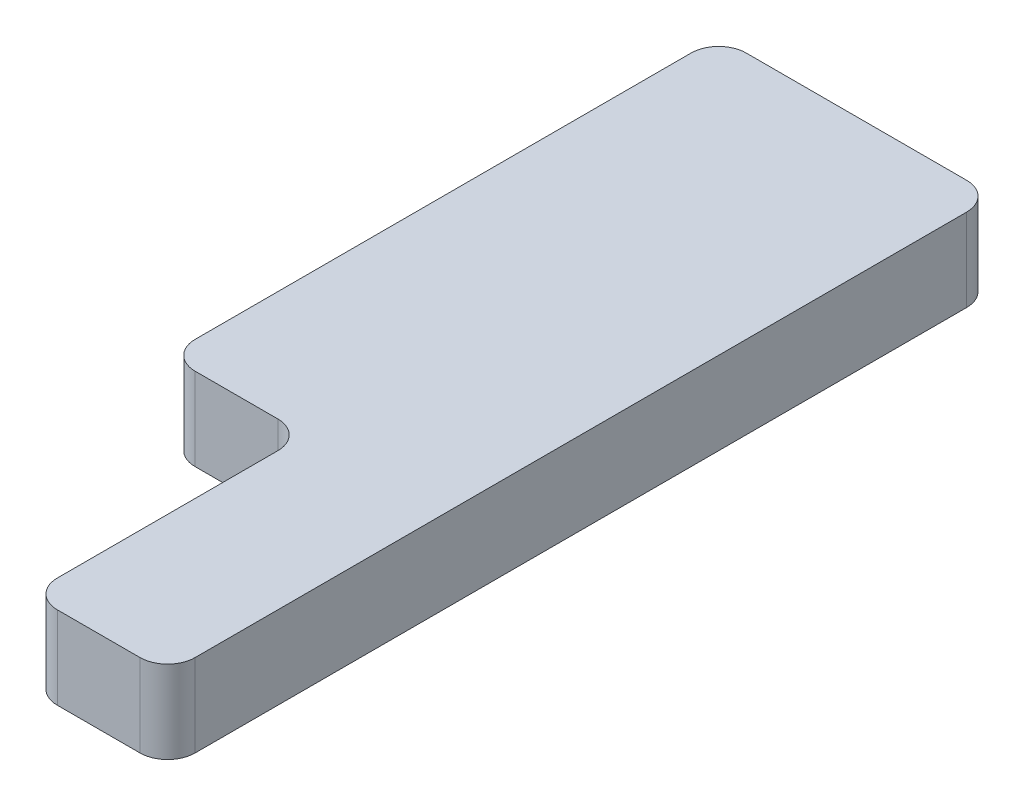
ISO-10303-21;
HEADER;
FILE_DESCRIPTION(('STEP AP214'),'2;1');
FILE_NAME('part.step','',(''),(''),'','','');
FILE_SCHEMA(('AUTOMOTIVE_DESIGN { 1 0 10303 214 1 1 1 1 }'));
ENDSEC;
DATA;
#1=APPLICATION_CONTEXT('core data for automotive mechanical design processes');
#2=APPLICATION_PROTOCOL_DEFINITION('international standard','automotive_design',2000,#1);
#3=PRODUCT_CONTEXT('',#1,'mechanical');
#4=PRODUCT('Part','Part','',(#3));
#5=PRODUCT_RELATED_PRODUCT_CATEGORY('part','',(#4));
#6=PRODUCT_DEFINITION_FORMATION('','',#4);
#7=PRODUCT_DEFINITION_CONTEXT('part definition',#1,'design');
#8=PRODUCT_DEFINITION('design','',#6,#7);
#9=PRODUCT_DEFINITION_SHAPE('','',#8);
#10=(LENGTH_UNIT() NAMED_UNIT(*) SI_UNIT(.MILLI.,.METRE.));
#11=(NAMED_UNIT(*) PLANE_ANGLE_UNIT() SI_UNIT($,.RADIAN.));
#12=(NAMED_UNIT(*) SI_UNIT($,.STERADIAN.) SOLID_ANGLE_UNIT());
#13=UNCERTAINTY_MEASURE_WITH_UNIT(LENGTH_MEASURE(1.E-05),#10,'distance_accuracy_value','');
#14=(GEOMETRIC_REPRESENTATION_CONTEXT(3) GLOBAL_UNCERTAINTY_ASSIGNED_CONTEXT((#13)) GLOBAL_UNIT_ASSIGNED_CONTEXT((#10,
#11,#12)) REPRESENTATION_CONTEXT('',''));
#15=CARTESIAN_POINT('',(0.,0.,0.));
#16=DIRECTION('',(0.,0.,1.));
#17=DIRECTION('',(1.,0.,0.));
#18=AXIS2_PLACEMENT_3D('',#15,#16,#17);
#19=CARTESIAN_POINT('',(4.,3.,-14.));
#20=DIRECTION('',(0.,-1.,0.));
#21=DIRECTION('',(0.,0.,-1.));
#22=AXIS2_PLACEMENT_3D('',#19,#20,#21);
#23=CYLINDRICAL_SURFACE('',#22,1.);
#24=DIRECTION('',(0.,-1.,0.));
#25=VECTOR('',#24,1.);
#26=CARTESIAN_POINT('',(4.,3.,-15.));
#27=LINE('',#26,#25);
#28=CARTESIAN_POINT('',(4.,3.,-15.));
#29=VERTEX_POINT('',#28);
#30=CARTESIAN_POINT('',(4.,0.,-15.));
#31=VERTEX_POINT('',#30);
#32=EDGE_CURVE('E191',#29,#31,#27,.T.);
#33=ORIENTED_EDGE('',*,*,#32,.F.);
#34=CARTESIAN_POINT('',(4.,3.,-14.));
#35=DIRECTION('',(0.,-1.,0.));
#36=DIRECTION('',(0.,0.,-1.));
#37=AXIS2_PLACEMENT_3D('',#34,#35,#36);
#38=CIRCLE('',#37,1.);
#39=CARTESIAN_POINT('',(5.,3.,-14.));
#40=VERTEX_POINT('',#39);
#41=EDGE_CURVE('E40',#40,#29,#38,.F.);
#42=ORIENTED_EDGE('',*,*,#41,.F.);
#43=DIRECTION('',(0.,-1.,0.));
#44=VECTOR('',#43,1.);
#45=CARTESIAN_POINT('',(5.,3.,-14.));
#46=LINE('',#45,#44);
#47=CARTESIAN_POINT('',(5.,0.,-14.));
#48=VERTEX_POINT('',#47);
#49=EDGE_CURVE('E194',#48,#40,#46,.F.);
#50=ORIENTED_EDGE('',*,*,#49,.F.);
#51=CARTESIAN_POINT('',(4.,0.,-14.));
#52=DIRECTION('',(0.,-1.,0.));
#53=DIRECTION('',(0.,0.,-1.));
#54=AXIS2_PLACEMENT_3D('',#51,#52,#53);
#55=CIRCLE('',#54,1.);
#56=EDGE_CURVE('E11',#31,#48,#55,.T.);
#57=ORIENTED_EDGE('',*,*,#56,.F.);
#58=EDGE_LOOP('',(#33,#42,#50,#57));
#59=FACE_BOUND('',#58,.T.);
#60=ADVANCED_FACE('F33',(#59),#23,.T.);
#61=CARTESIAN_POINT('',(-4.,3.,-14.));
#62=DIRECTION('',(0.,1.,0.));
#63=DIRECTION('',(0.,0.,1.));
#64=AXIS2_PLACEMENT_3D('',#61,#62,#63);
#65=CYLINDRICAL_SURFACE('',#64,1.);
#66=DIRECTION('',(0.,1.,0.));
#67=VECTOR('',#66,1.);
#68=CARTESIAN_POINT('',(-4.,3.,-15.));
#69=LINE('',#68,#67);
#70=CARTESIAN_POINT('',(-4.,0.,-15.));
#71=VERTEX_POINT('',#70);
#72=CARTESIAN_POINT('',(-4.,3.,-15.));
#73=VERTEX_POINT('',#72);
#74=EDGE_CURVE('E180',#71,#73,#69,.T.);
#75=ORIENTED_EDGE('',*,*,#74,.F.);
#76=CARTESIAN_POINT('',(-4.,0.,-14.));
#77=DIRECTION('',(0.,-1.,0.));
#78=DIRECTION('',(0.,0.,-1.));
#79=AXIS2_PLACEMENT_3D('',#76,#77,#78);
#80=CIRCLE('',#79,1.);
#81=CARTESIAN_POINT('',(-5.,0.,-14.));
#82=VERTEX_POINT('',#81);
#83=EDGE_CURVE('E186',#82,#71,#80,.T.);
#84=ORIENTED_EDGE('',*,*,#83,.F.);
#85=DIRECTION('',(0.,1.,0.));
#86=VECTOR('',#85,1.);
#87=CARTESIAN_POINT('',(-5.,3.,-14.));
#88=LINE('',#87,#86);
#89=CARTESIAN_POINT('',(-5.,3.,-14.));
#90=VERTEX_POINT('',#89);
#91=EDGE_CURVE('E183',#90,#82,#88,.F.);
#92=ORIENTED_EDGE('',*,*,#91,.F.);
#93=CARTESIAN_POINT('',(-4.,3.,-14.));
#94=DIRECTION('',(0.,-1.,0.));
#95=DIRECTION('',(0.,0.,-1.));
#96=AXIS2_PLACEMENT_3D('',#93,#94,#95);
#97=CIRCLE('',#96,1.);
#98=EDGE_CURVE('E189',#73,#90,#97,.F.);
#99=ORIENTED_EDGE('',*,*,#98,.F.);
#100=EDGE_LOOP('',(#75,#84,#92,#99));
#101=FACE_BOUND('',#100,.T.);
#102=ADVANCED_FACE('F230',(#101),#65,.T.);
#103=CARTESIAN_POINT('',(-4.,3.,4.));
#104=DIRECTION('',(0.,1.,0.));
#105=DIRECTION('',(0.,0.,1.));
#106=AXIS2_PLACEMENT_3D('',#103,#104,#105);
#107=CYLINDRICAL_SURFACE('',#106,1.);
#108=DIRECTION('',(0.,1.,0.));
#109=VECTOR('',#108,1.);
#110=CARTESIAN_POINT('',(-5.,3.,4.));
#111=LINE('',#110,#109);
#112=CARTESIAN_POINT('',(-5.,0.,4.));
#113=VERTEX_POINT('',#112);
#114=CARTESIAN_POINT('',(-5.,3.,4.));
#115=VERTEX_POINT('',#114);
#116=EDGE_CURVE('E169',#113,#115,#111,.T.);
#117=ORIENTED_EDGE('',*,*,#116,.F.);
#118=CARTESIAN_POINT('',(-4.,0.,4.));
#119=DIRECTION('',(0.,-1.,0.));
#120=DIRECTION('',(0.,0.,-1.));
#121=AXIS2_PLACEMENT_3D('',#118,#119,#120);
#122=CIRCLE('',#121,1.);
#123=CARTESIAN_POINT('',(-4.,0.,5.));
#124=VERTEX_POINT('',#123);
#125=EDGE_CURVE('E175',#124,#113,#122,.T.);
#126=ORIENTED_EDGE('',*,*,#125,.F.);
#127=DIRECTION('',(0.,1.,0.));
#128=VECTOR('',#127,1.);
#129=CARTESIAN_POINT('',(-4.,0.,5.));
#130=LINE('',#129,#128);
#131=CARTESIAN_POINT('',(-4.,3.,5.));
#132=VERTEX_POINT('',#131);
#133=EDGE_CURVE('E172',#132,#124,#130,.F.);
#134=ORIENTED_EDGE('',*,*,#133,.F.);
#135=CARTESIAN_POINT('',(-4.,3.,4.));
#136=DIRECTION('',(0.,-1.,0.));
#137=DIRECTION('',(0.,0.,-1.));
#138=AXIS2_PLACEMENT_3D('',#135,#136,#137);
#139=CIRCLE('',#138,1.);
#140=EDGE_CURVE('E178',#115,#132,#139,.F.);
#141=ORIENTED_EDGE('',*,*,#140,.F.);
#142=EDGE_LOOP('',(#117,#126,#134,#141));
#143=FACE_BOUND('',#142,.T.);
#144=ADVANCED_FACE('F225',(#143),#107,.T.);
#145=CARTESIAN_POINT('',(-1.,0.,6.));
#146=DIRECTION('',(0.,-1.,0.));
#147=DIRECTION('',(0.,0.,-1.));
#148=AXIS2_PLACEMENT_3D('',#145,#146,#147);
#149=CYLINDRICAL_SURFACE('',#148,1.);
#150=DIRECTION('',(0.,1.,0.));
#151=VECTOR('',#150,1.);
#152=CARTESIAN_POINT('',(-1.,0.,5.));
#153=LINE('',#152,#151);
#154=CARTESIAN_POINT('',(-1.,0.,5.));
#155=VERTEX_POINT('',#154);
#156=CARTESIAN_POINT('',(-1.,3.,5.));
#157=VERTEX_POINT('',#156);
#158=EDGE_CURVE('E159',#155,#157,#153,.T.);
#159=ORIENTED_EDGE('',*,*,#158,.F.);
#160=CARTESIAN_POINT('',(-1.,0.,6.));
#161=DIRECTION('',(0.,-1.,0.));
#162=DIRECTION('',(0.,0.,-1.));
#163=AXIS2_PLACEMENT_3D('',#160,#161,#162);
#164=CIRCLE('',#163,1.);
#165=CARTESIAN_POINT('',(0.,0.,6.));
#166=VERTEX_POINT('',#165);
#167=EDGE_CURVE('E165',#155,#166,#164,.T.);
#168=ORIENTED_EDGE('',*,*,#167,.T.);
#169=DIRECTION('',(0.,1.,0.));
#170=VECTOR('',#169,1.);
#171=CARTESIAN_POINT('',(0.,0.,6.));
#172=LINE('',#171,#170);
#173=CARTESIAN_POINT('',(0.,3.,6.));
#174=VERTEX_POINT('',#173);
#175=EDGE_CURVE('E162',#174,#166,#172,.F.);
#176=ORIENTED_EDGE('',*,*,#175,.F.);
#177=CARTESIAN_POINT('',(-1.,3.,6.));
#178=DIRECTION('',(0.,-1.,0.));
#179=DIRECTION('',(0.,0.,-1.));
#180=AXIS2_PLACEMENT_3D('',#177,#178,#179);
#181=CIRCLE('',#180,1.);
#182=EDGE_CURVE('E167',#174,#157,#181,.F.);
#183=ORIENTED_EDGE('',*,*,#182,.T.);
#184=EDGE_LOOP('',(#159,#168,#176,#183));
#185=FACE_BOUND('',#184,.T.);
#186=ADVANCED_FACE('F236',(#185),#149,.F.);
#187=CARTESIAN_POINT('',(0.999999999999999,0.,14.));
#188=DIRECTION('',(0.,1.,0.));
#189=DIRECTION('',(0.,0.,1.));
#190=AXIS2_PLACEMENT_3D('',#187,#188,#189);
#191=CYLINDRICAL_SURFACE('',#190,1.);
#192=DIRECTION('',(0.,1.,0.));
#193=VECTOR('',#192,1.);
#194=CARTESIAN_POINT('',(0.,0.,14.));
#195=LINE('',#194,#193);
#196=CARTESIAN_POINT('',(0.,0.,14.));
#197=VERTEX_POINT('',#196);
#198=CARTESIAN_POINT('',(0.,3.,14.));
#199=VERTEX_POINT('',#198);
#200=EDGE_CURVE('E139',#197,#199,#195,.T.);
#201=ORIENTED_EDGE('',*,*,#200,.F.);
#202=CARTESIAN_POINT('',(0.999999999999999,0.,14.));
#203=DIRECTION('',(0.,-1.,0.));
#204=DIRECTION('',(0.,0.,-1.));
#205=AXIS2_PLACEMENT_3D('',#202,#203,#204);
#206=CIRCLE('',#205,1.);
#207=CARTESIAN_POINT('',(0.999999999999999,0.,15.));
#208=VERTEX_POINT('',#207);
#209=EDGE_CURVE('E156',#208,#197,#206,.T.);
#210=ORIENTED_EDGE('',*,*,#209,.F.);
#211=DIRECTION('',(0.,1.,0.));
#212=VECTOR('',#211,1.);
#213=CARTESIAN_POINT('',(0.999999999999999,3.,15.));
#214=LINE('',#213,#212);
#215=CARTESIAN_POINT('',(0.999999999999999,3.,15.));
#216=VERTEX_POINT('',#215);
#217=EDGE_CURVE('E154',#216,#208,#214,.F.);
#218=ORIENTED_EDGE('',*,*,#217,.F.);
#219=CARTESIAN_POINT('',(0.999999999999999,3.,14.));
#220=DIRECTION('',(0.,-1.,0.));
#221=DIRECTION('',(0.,0.,-1.));
#222=AXIS2_PLACEMENT_3D('',#219,#220,#221);
#223=CIRCLE('',#222,1.);
#224=EDGE_CURVE('E125',#199,#216,#223,.F.);
#225=ORIENTED_EDGE('',*,*,#224,.F.);
#226=EDGE_LOOP('',(#201,#210,#218,#225));
#227=FACE_BOUND('',#226,.T.);
#228=ADVANCED_FACE('F241',(#227),#191,.T.);
#229=CARTESIAN_POINT('',(4.,3.,14.));
#230=DIRECTION('',(0.,1.,0.));
#231=DIRECTION('',(0.,0.,1.));
#232=AXIS2_PLACEMENT_3D('',#229,#230,#231);
#233=CYLINDRICAL_SURFACE('',#232,1.);
#234=DIRECTION('',(0.,1.,0.));
#235=VECTOR('',#234,1.);
#236=CARTESIAN_POINT('',(4.,3.,15.));
#237=LINE('',#236,#235);
#238=CARTESIAN_POINT('',(4.,0.,15.));
#239=VERTEX_POINT('',#238);
#240=CARTESIAN_POINT('',(4.,3.,15.));
#241=VERTEX_POINT('',#240);
#242=EDGE_CURVE('E130',#239,#241,#237,.T.);
#243=ORIENTED_EDGE('',*,*,#242,.F.);
#244=CARTESIAN_POINT('',(4.,0.,14.));
#245=DIRECTION('',(0.,-1.,0.));
#246=DIRECTION('',(0.,0.,-1.));
#247=AXIS2_PLACEMENT_3D('',#244,#245,#246);
#248=CIRCLE('',#247,1.);
#249=CARTESIAN_POINT('',(5.,0.,14.));
#250=VERTEX_POINT('',#249);
#251=EDGE_CURVE('E140',#250,#239,#248,.T.);
#252=ORIENTED_EDGE('',*,*,#251,.F.);
#253=DIRECTION('',(0.,1.,0.));
#254=VECTOR('',#253,1.);
#255=CARTESIAN_POINT('',(5.,3.,14.));
#256=LINE('',#255,#254);
#257=CARTESIAN_POINT('',(5.,3.,14.));
#258=VERTEX_POINT('',#257);
#259=EDGE_CURVE('E137',#258,#250,#256,.F.);
#260=ORIENTED_EDGE('',*,*,#259,.F.);
#261=CARTESIAN_POINT('',(4.,3.,14.));
#262=DIRECTION('',(0.,-1.,0.));
#263=DIRECTION('',(0.,0.,-1.));
#264=AXIS2_PLACEMENT_3D('',#261,#262,#263);
#265=CIRCLE('',#264,1.);
#266=EDGE_CURVE('E122',#241,#258,#265,.F.);
#267=ORIENTED_EDGE('',*,*,#266,.F.);
#268=EDGE_LOOP('',(#243,#252,#260,#267));
#269=FACE_BOUND('',#268,.T.);
#270=ADVANCED_FACE('F135',(#269),#233,.T.);
#271=CARTESIAN_POINT('',(5.,3.,15.));
#272=DIRECTION('',(-1.,0.,0.));
#273=DIRECTION('',(0.,0.,1.));
#274=AXIS2_PLACEMENT_3D('',#271,#272,#273);
#275=PLANE('',#274);
#276=DIRECTION('',(0.,0.,-1.));
#277=VECTOR('',#276,1.);
#278=CARTESIAN_POINT('',(5.,0.,15.));
#279=LINE('',#278,#277);
#280=EDGE_CURVE('E207',#250,#48,#279,.T.);
#281=ORIENTED_EDGE('',*,*,#280,.T.);
#282=ORIENTED_EDGE('',*,*,#49,.T.);
#283=DIRECTION('',(0.,0.,-1.));
#284=VECTOR('',#283,1.);
#285=CARTESIAN_POINT('',(5.,3.,15.));
#286=LINE('',#285,#284);
#287=EDGE_CURVE('E198',#258,#40,#286,.T.);
#288=ORIENTED_EDGE('',*,*,#287,.F.);
#289=ORIENTED_EDGE('',*,*,#259,.T.);
#290=EDGE_LOOP('',(#281,#282,#288,#289));
#291=FACE_BOUND('',#290,.T.);
#292=ADVANCED_FACE('F248',(#291),#275,.F.);
#293=CARTESIAN_POINT('',(-5.,3.,-15.));
#294=DIRECTION('',(0.,0.,1.));
#295=DIRECTION('',(1.,0.,0.));
#296=AXIS2_PLACEMENT_3D('',#293,#294,#295);
#297=PLANE('',#296);
#298=DIRECTION('',(-1.,0.,0.));
#299=VECTOR('',#298,1.);
#300=CARTESIAN_POINT('',(-5.,3.,-15.));
#301=LINE('',#300,#299);
#302=EDGE_CURVE('E196',#29,#73,#301,.T.);
#303=ORIENTED_EDGE('',*,*,#302,.F.);
#304=ORIENTED_EDGE('',*,*,#32,.T.);
#305=DIRECTION('',(-1.,0.,0.));
#306=VECTOR('',#305,1.);
#307=CARTESIAN_POINT('',(-5.,0.,-15.));
#308=LINE('',#307,#306);
#309=EDGE_CURVE('E210',#31,#71,#308,.T.);
#310=ORIENTED_EDGE('',*,*,#309,.T.);
#311=ORIENTED_EDGE('',*,*,#74,.T.);
#312=EDGE_LOOP('',(#303,#304,#310,#311));
#313=FACE_BOUND('',#312,.T.);
#314=ADVANCED_FACE('F200',(#313),#297,.F.);
#315=CARTESIAN_POINT('',(-5.,3.,15.));
#316=DIRECTION('',(1.,0.,0.));
#317=DIRECTION('',(0.,0.,-1.));
#318=AXIS2_PLACEMENT_3D('',#315,#316,#317);
#319=PLANE('',#318);
#320=DIRECTION('',(0.,0.,1.));
#321=VECTOR('',#320,1.);
#322=CARTESIAN_POINT('',(-5.,3.,15.));
#323=LINE('',#322,#321);
#324=EDGE_CURVE('E131',#90,#115,#323,.T.);
#325=ORIENTED_EDGE('',*,*,#324,.F.);
#326=ORIENTED_EDGE('',*,*,#91,.T.);
#327=DIRECTION('',(0.,0.,1.));
#328=VECTOR('',#327,1.);
#329=CARTESIAN_POINT('',(-5.,0.,15.));
#330=LINE('',#329,#328);
#331=EDGE_CURVE('E212',#82,#113,#330,.T.);
#332=ORIENTED_EDGE('',*,*,#331,.T.);
#333=ORIENTED_EDGE('',*,*,#116,.T.);
#334=EDGE_LOOP('',(#325,#326,#332,#333));
#335=FACE_BOUND('',#334,.T.);
#336=ADVANCED_FACE('F216',(#335),#319,.F.);
#337=CARTESIAN_POINT('',(-5.,3.,15.));
#338=DIRECTION('',(0.,0.,-1.));
#339=DIRECTION('',(-1.,0.,0.));
#340=AXIS2_PLACEMENT_3D('',#337,#338,#339);
#341=PLANE('',#340);
#342=DIRECTION('',(1.,0.,0.));
#343=VECTOR('',#342,1.);
#344=CARTESIAN_POINT('',(-5.,3.,15.));
#345=LINE('',#344,#343);
#346=EDGE_CURVE('E118',#216,#241,#345,.T.);
#347=ORIENTED_EDGE('',*,*,#346,.F.);
#348=ORIENTED_EDGE('',*,*,#217,.T.);
#349=DIRECTION('',(1.,0.,0.));
#350=VECTOR('',#349,1.);
#351=CARTESIAN_POINT('',(-5.,0.,15.));
#352=LINE('',#351,#350);
#353=EDGE_CURVE('E144',#208,#239,#352,.T.);
#354=ORIENTED_EDGE('',*,*,#353,.T.);
#355=ORIENTED_EDGE('',*,*,#242,.T.);
#356=EDGE_LOOP('',(#347,#348,#354,#355));
#357=FACE_BOUND('',#356,.T.);
#358=ADVANCED_FACE('F142',(#357),#341,.F.);
#359=CARTESIAN_POINT('',(0.,3.,0.));
#360=DIRECTION('',(0.,-1.,0.));
#361=DIRECTION('',(0.,0.,-1.));
#362=AXIS2_PLACEMENT_3D('',#359,#360,#361);
#363=PLANE('',#362);
#364=ORIENTED_EDGE('',*,*,#287,.T.);
#365=ORIENTED_EDGE('',*,*,#41,.T.);
#366=ORIENTED_EDGE('',*,*,#302,.T.);
#367=ORIENTED_EDGE('',*,*,#98,.T.);
#368=ORIENTED_EDGE('',*,*,#324,.T.);
#369=ORIENTED_EDGE('',*,*,#140,.T.);
#370=DIRECTION('',(-1.,0.,0.));
#371=VECTOR('',#370,1.);
#372=CARTESIAN_POINT('',(-5.,3.,5.));
#373=LINE('',#372,#371);
#374=EDGE_CURVE('E228',#157,#132,#373,.T.);
#375=ORIENTED_EDGE('',*,*,#374,.F.);
#376=ORIENTED_EDGE('',*,*,#182,.F.);
#377=DIRECTION('',(0.,0.,-1.));
#378=VECTOR('',#377,1.);
#379=CARTESIAN_POINT('',(0.,3.,15.));
#380=LINE('',#379,#378);
#381=EDGE_CURVE('E273',#199,#174,#380,.T.);
#382=ORIENTED_EDGE('',*,*,#381,.F.);
#383=ORIENTED_EDGE('',*,*,#224,.T.);
#384=ORIENTED_EDGE('',*,*,#346,.T.);
#385=ORIENTED_EDGE('',*,*,#266,.T.);
#386=EDGE_LOOP('',(#364,#365,#366,#367,#368,#369,#375,#376,#382,#383,#384,#385));
#387=FACE_BOUND('',#386,.T.);
#388=ADVANCED_FACE('F121',(#387),#363,.F.);
#389=CARTESIAN_POINT('',(0.,0.,0.));
#390=DIRECTION('',(0.,-1.,0.));
#391=DIRECTION('',(0.,0.,-1.));
#392=AXIS2_PLACEMENT_3D('',#389,#390,#391);
#393=PLANE('',#392);
#394=ORIENTED_EDGE('',*,*,#309,.F.);
#395=ORIENTED_EDGE('',*,*,#56,.T.);
#396=ORIENTED_EDGE('',*,*,#280,.F.);
#397=ORIENTED_EDGE('',*,*,#251,.T.);
#398=ORIENTED_EDGE('',*,*,#353,.F.);
#399=ORIENTED_EDGE('',*,*,#209,.T.);
#400=DIRECTION('',(0.,0.,-1.));
#401=VECTOR('',#400,1.);
#402=CARTESIAN_POINT('',(0.,0.,15.));
#403=LINE('',#402,#401);
#404=EDGE_CURVE('E272',#197,#166,#403,.T.);
#405=ORIENTED_EDGE('',*,*,#404,.T.);
#406=ORIENTED_EDGE('',*,*,#167,.F.);
#407=DIRECTION('',(-1.,0.,0.));
#408=VECTOR('',#407,1.);
#409=CARTESIAN_POINT('',(-5.,0.,5.));
#410=LINE('',#409,#408);
#411=EDGE_CURVE('E211',#155,#124,#410,.T.);
#412=ORIENTED_EDGE('',*,*,#411,.T.);
#413=ORIENTED_EDGE('',*,*,#125,.T.);
#414=ORIENTED_EDGE('',*,*,#331,.F.);
#415=ORIENTED_EDGE('',*,*,#83,.T.);
#416=EDGE_LOOP('',(#394,#395,#396,#397,#398,#399,#405,#406,#412,#413,#414,#415));
#417=FACE_BOUND('',#416,.T.);
#418=ADVANCED_FACE('F220',(#417),#393,.T.);
#419=CARTESIAN_POINT('',(-5.,0.,5.));
#420=DIRECTION('',(0.,0.,-1.));
#421=DIRECTION('',(-1.,0.,0.));
#422=AXIS2_PLACEMENT_3D('',#419,#420,#421);
#423=PLANE('',#422);
#424=ORIENTED_EDGE('',*,*,#374,.T.);
#425=ORIENTED_EDGE('',*,*,#133,.T.);
#426=ORIENTED_EDGE('',*,*,#411,.F.);
#427=ORIENTED_EDGE('',*,*,#158,.T.);
#428=EDGE_LOOP('',(#424,#425,#426,#427));
#429=FACE_BOUND('',#428,.T.);
#430=ADVANCED_FACE('F260',(#429),#423,.F.);
#431=CARTESIAN_POINT('',(0.,0.,15.));
#432=DIRECTION('',(1.,0.,0.));
#433=DIRECTION('',(0.,0.,-1.));
#434=AXIS2_PLACEMENT_3D('',#431,#432,#433);
#435=PLANE('',#434);
#436=ORIENTED_EDGE('',*,*,#381,.T.);
#437=ORIENTED_EDGE('',*,*,#175,.T.);
#438=ORIENTED_EDGE('',*,*,#404,.F.);
#439=ORIENTED_EDGE('',*,*,#200,.T.);
#440=EDGE_LOOP('',(#436,#437,#438,#439));
#441=FACE_BOUND('',#440,.T.);
#442=ADVANCED_FACE('F263',(#441),#435,.F.);
#443=CLOSED_SHELL('',(#60,#102,#144,#186,#228,#270,#292,#314,#336,#358,#388,#418,#430,#442));
#444=MANIFOLD_SOLID_BREP('B2',#443);
#445=ADVANCED_BREP_SHAPE_REPRESENTATION('',(#18,#444),#14);
#446=SHAPE_DEFINITION_REPRESENTATION(#9,#445);
ENDSEC;
END-ISO-10303-21;
